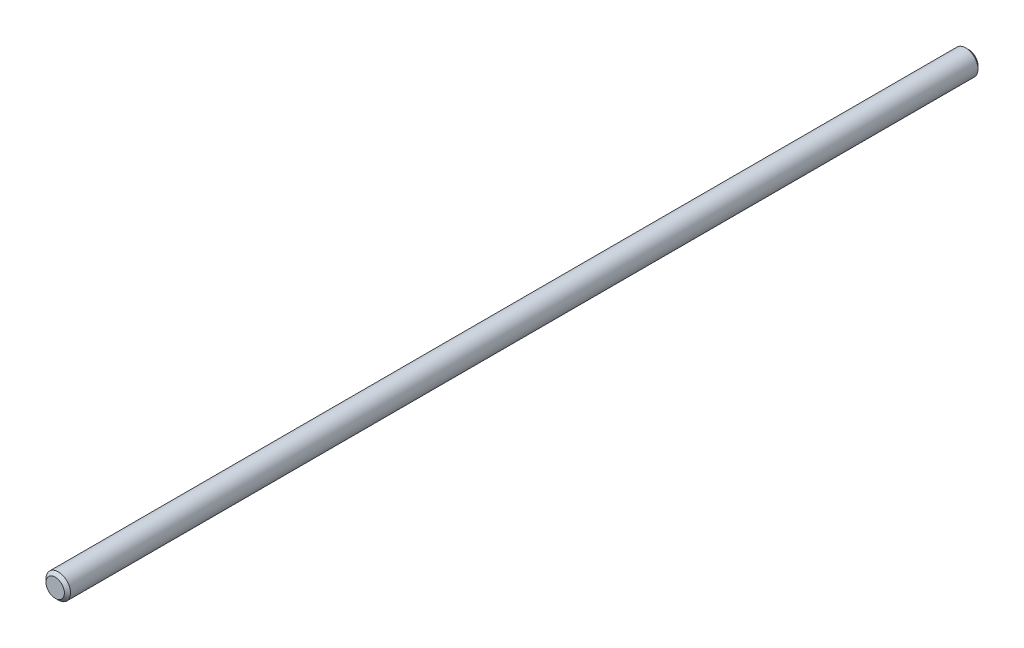
ISO-10303-21;
HEADER;
FILE_DESCRIPTION(('STEP AP214'),'2;1');
FILE_NAME('part.step','',(''),(''),'','','');
FILE_SCHEMA(('AUTOMOTIVE_DESIGN { 1 0 10303 214 1 1 1 1 }'));
ENDSEC;
DATA;
#1=APPLICATION_CONTEXT('core data for automotive mechanical design processes');
#2=APPLICATION_PROTOCOL_DEFINITION('international standard','automotive_design',2000,#1);
#3=PRODUCT_CONTEXT('',#1,'mechanical');
#4=PRODUCT('Part','Part','',(#3));
#5=PRODUCT_RELATED_PRODUCT_CATEGORY('part','',(#4));
#6=PRODUCT_DEFINITION_FORMATION('','',#4);
#7=PRODUCT_DEFINITION_CONTEXT('part definition',#1,'design');
#8=PRODUCT_DEFINITION('design','',#6,#7);
#9=PRODUCT_DEFINITION_SHAPE('','',#8);
#10=(LENGTH_UNIT() NAMED_UNIT(*) SI_UNIT(.MILLI.,.METRE.));
#11=(NAMED_UNIT(*) PLANE_ANGLE_UNIT() SI_UNIT($,.RADIAN.));
#12=(NAMED_UNIT(*) SI_UNIT($,.STERADIAN.) SOLID_ANGLE_UNIT());
#13=UNCERTAINTY_MEASURE_WITH_UNIT(LENGTH_MEASURE(1.E-05),#10,'distance_accuracy_value','');
#14=(GEOMETRIC_REPRESENTATION_CONTEXT(3) GLOBAL_UNCERTAINTY_ASSIGNED_CONTEXT((#13)) GLOBAL_UNIT_ASSIGNED_CONTEXT((#10,
#11,#12)) REPRESENTATION_CONTEXT('',''));
#15=CARTESIAN_POINT('',(0.,0.,0.));
#16=DIRECTION('',(0.,0.,1.));
#17=DIRECTION('',(1.,0.,0.));
#18=AXIS2_PLACEMENT_3D('',#15,#16,#17);
#19=CARTESIAN_POINT('',(0.,0.,298.));
#20=DIRECTION('',(0.,0.,-1.));
#21=DIRECTION('',(-1.,0.,0.));
#22=AXIS2_PLACEMENT_3D('',#19,#20,#21);
#23=CYLINDRICAL_SURFACE('',#22,4.);
#24=CARTESIAN_POINT('',(0.,0.,297.));
#25=DIRECTION('',(0.,0.,1.));
#26=DIRECTION('',(1.,0.,0.));
#27=AXIS2_PLACEMENT_3D('',#24,#25,#26);
#28=CIRCLE('',#27,4.);
#29=CARTESIAN_POINT('',(4.,0.,297.));
#30=VERTEX_POINT('',#29);
#31=EDGE_CURVE('E40',#30,#30,#28,.F.);
#32=ORIENTED_EDGE('',*,*,#31,.T.);
#33=EDGE_LOOP('',(#32));
#34=FACE_BOUND('',#33,.T.);
#35=CARTESIAN_POINT('',(0.,0.,0.999999999999945));
#36=DIRECTION('',(0.,0.,1.));
#37=DIRECTION('',(1.,0.,0.));
#38=AXIS2_PLACEMENT_3D('',#35,#36,#37);
#39=CIRCLE('',#38,4.);
#40=CARTESIAN_POINT('',(4.,0.,0.999999999999945));
#41=VERTEX_POINT('',#40);
#42=EDGE_CURVE('E44',#41,#41,#39,.T.);
#43=ORIENTED_EDGE('',*,*,#42,.T.);
#44=EDGE_LOOP('',(#43));
#45=FACE_BOUND('',#44,.T.);
#46=ADVANCED_FACE('F33',(#34,#45),#23,.T.);
#47=CARTESIAN_POINT('',(0.,0.,298.));
#48=DIRECTION('',(0.,0.,1.));
#49=DIRECTION('',(1.,0.,0.));
#50=AXIS2_PLACEMENT_3D('',#47,#48,#49);
#51=PLANE('',#50);
#52=CARTESIAN_POINT('',(0.,0.,298.));
#53=DIRECTION('',(0.,0.,1.));
#54=DIRECTION('',(1.,0.,0.));
#55=AXIS2_PLACEMENT_3D('',#52,#53,#54);
#56=CIRCLE('',#55,3.00000000000006);
#57=CARTESIAN_POINT('',(3.00000000000006,0.,298.));
#58=VERTEX_POINT('',#57);
#59=EDGE_CURVE('E48',#58,#58,#56,.T.);
#60=ORIENTED_EDGE('',*,*,#59,.T.);
#61=EDGE_LOOP('',(#60));
#62=FACE_BOUND('',#61,.T.);
#63=ADVANCED_FACE('F54',(#62),#51,.T.);
#64=CARTESIAN_POINT('',(0.,0.,0.));
#65=DIRECTION('',(0.,0.,1.));
#66=DIRECTION('',(1.,0.,0.));
#67=AXIS2_PLACEMENT_3D('',#64,#65,#66);
#68=PLANE('',#67);
#69=CARTESIAN_POINT('',(0.,0.,0.));
#70=DIRECTION('',(0.,0.,1.));
#71=DIRECTION('',(1.,0.,0.));
#72=AXIS2_PLACEMENT_3D('',#69,#70,#71);
#73=CIRCLE('',#72,3.00000000000003);
#74=CARTESIAN_POINT('',(3.00000000000003,0.,0.));
#75=VERTEX_POINT('',#74);
#76=EDGE_CURVE('E10',#75,#75,#73,.F.);
#77=ORIENTED_EDGE('',*,*,#76,.T.);
#78=EDGE_LOOP('',(#77));
#79=FACE_BOUND('',#78,.T.);
#80=ADVANCED_FACE('F58',(#79),#68,.F.);
#81=CARTESIAN_POINT('',(0.,0.,298.));
#82=DIRECTION('',(0.,0.,-1.));
#83=DIRECTION('',(-1.,0.,0.));
#84=AXIS2_PLACEMENT_3D('',#81,#82,#83);
#85=CONICAL_SURFACE('',#84,3.00000000000006,0.785398163397447);
#86=ORIENTED_EDGE('',*,*,#31,.F.);
#87=EDGE_LOOP('',(#86));
#88=FACE_BOUND('',#87,.T.);
#89=ORIENTED_EDGE('',*,*,#59,.F.);
#90=EDGE_LOOP('',(#89));
#91=FACE_BOUND('',#90,.T.);
#92=ADVANCED_FACE('F56',(#88,#91),#85,.T.);
#93=CARTESIAN_POINT('',(0.,0.,0.999999999999945));
#94=DIRECTION('',(0.,0.,1.));
#95=DIRECTION('',(1.,0.,0.));
#96=AXIS2_PLACEMENT_3D('',#93,#94,#95);
#97=CONICAL_SURFACE('',#96,4.,0.785398163397461);
#98=ORIENTED_EDGE('',*,*,#76,.F.);
#99=EDGE_LOOP('',(#98));
#100=FACE_BOUND('',#99,.T.);
#101=ORIENTED_EDGE('',*,*,#42,.F.);
#102=EDGE_LOOP('',(#101));
#103=FACE_BOUND('',#102,.T.);
#104=ADVANCED_FACE('F35',(#100,#103),#97,.T.);
#105=CLOSED_SHELL('',(#46,#63,#80,#92,#104));
#106=MANIFOLD_SOLID_BREP('B2',#105);
#107=ADVANCED_BREP_SHAPE_REPRESENTATION('',(#18,#106),#14);
#108=SHAPE_DEFINITION_REPRESENTATION(#9,#107);
ENDSEC;
END-ISO-10303-21;
